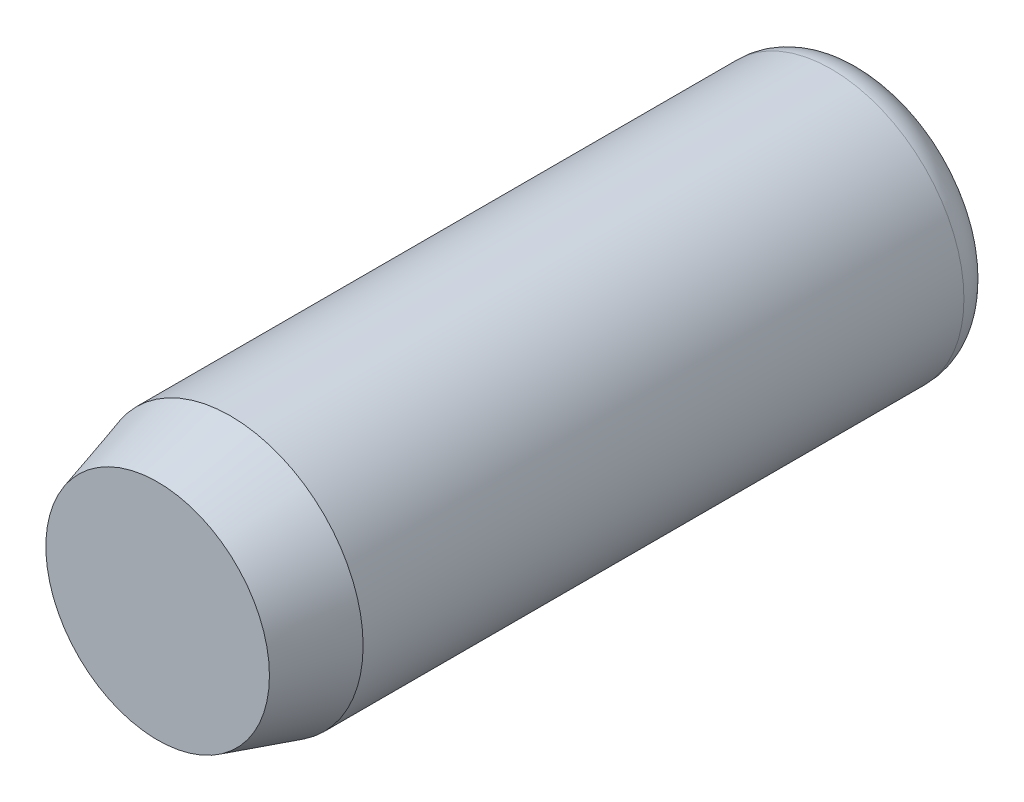
ISO-10303-21;
HEADER;
FILE_DESCRIPTION(('STEP AP214'),'2;1');
FILE_NAME('part.step','',(''),(''),'','','');
FILE_SCHEMA(('AUTOMOTIVE_DESIGN { 1 0 10303 214 1 1 1 1 }'));
ENDSEC;
DATA;
#1=APPLICATION_CONTEXT('core data for automotive mechanical design processes');
#2=APPLICATION_PROTOCOL_DEFINITION('international standard','automotive_design',2000,#1);
#3=PRODUCT_CONTEXT('',#1,'mechanical');
#4=PRODUCT('Part','Part','',(#3));
#5=PRODUCT_RELATED_PRODUCT_CATEGORY('part','',(#4));
#6=PRODUCT_DEFINITION_FORMATION('','',#4);
#7=PRODUCT_DEFINITION_CONTEXT('part definition',#1,'design');
#8=PRODUCT_DEFINITION('design','',#6,#7);
#9=PRODUCT_DEFINITION_SHAPE('','',#8);
#10=(LENGTH_UNIT() NAMED_UNIT(*) SI_UNIT(.MILLI.,.METRE.));
#11=(NAMED_UNIT(*) PLANE_ANGLE_UNIT() SI_UNIT($,.RADIAN.));
#12=(NAMED_UNIT(*) SI_UNIT($,.STERADIAN.) SOLID_ANGLE_UNIT());
#13=UNCERTAINTY_MEASURE_WITH_UNIT(LENGTH_MEASURE(1.E-05),#10,'distance_accuracy_value','');
#14=(GEOMETRIC_REPRESENTATION_CONTEXT(3) GLOBAL_UNCERTAINTY_ASSIGNED_CONTEXT((#13)) GLOBAL_UNIT_ASSIGNED_CONTEXT((#10,
#11,#12)) REPRESENTATION_CONTEXT('',''));
#15=CARTESIAN_POINT('',(0.,0.,0.));
#16=DIRECTION('',(0.,0.,1.));
#17=DIRECTION('',(1.,0.,0.));
#18=AXIS2_PLACEMENT_3D('',#15,#16,#17);
#19=CARTESIAN_POINT('',(0.,0.885825,-3.175));
#20=DIRECTION('',(0.,0.,1.));
#21=DIRECTION('',(1.,0.,0.));
#22=AXIS2_PLACEMENT_3D('',#19,#20,#21);
#23=PLANE('',#22);
#24=CARTESIAN_POINT('',(0.,0.,-3.175));
#25=DIRECTION('',(0.,0.,1.));
#26=DIRECTION('',(1.,0.,0.));
#27=AXIS2_PLACEMENT_3D('',#24,#25,#26);
#28=CIRCLE('',#27,0.885825);
#29=CARTESIAN_POINT('',(0.885825,0.,-3.175));
#30=VERTEX_POINT('',#29);
#31=EDGE_CURVE('E10',#30,#30,#28,.T.);
#32=ORIENTED_EDGE('',*,*,#31,.F.);
#33=EDGE_LOOP('',(#32));
#34=FACE_BOUND('',#33,.T.);
#35=ADVANCED_FACE('F37',(#34),#23,.F.);
#36=CARTESIAN_POINT('',(0.,0.,-2.8702));
#37=DIRECTION('',(0.,0.,1.));
#38=DIRECTION('',(1.,0.,0.));
#39=AXIS2_PLACEMENT_3D('',#36,#37,#38);
#40=TOROIDAL_SURFACE('',#39,0.885825,0.304800000000001);
#41=CARTESIAN_POINT('',(0.,0.,-2.8702));
#42=DIRECTION('',(0.,0.,1.));
#43=DIRECTION('',(1.,0.,0.));
#44=AXIS2_PLACEMENT_3D('',#41,#42,#43);
#45=CIRCLE('',#44,1.190625);
#46=CARTESIAN_POINT('',(1.190625,0.,-2.8702));
#47=VERTEX_POINT('',#46);
#48=EDGE_CURVE('E43',#47,#47,#45,.T.);
#49=ORIENTED_EDGE('',*,*,#48,.F.);
#50=EDGE_LOOP('',(#49));
#51=FACE_BOUND('',#50,.T.);
#52=ORIENTED_EDGE('',*,*,#31,.T.);
#53=EDGE_LOOP('',(#52));
#54=FACE_BOUND('',#53,.T.);
#55=ADVANCED_FACE('F67',(#51,#54),#40,.T.);
#56=CARTESIAN_POINT('',(0.,0.,3.175));
#57=DIRECTION('',(0.,0.,1.));
#58=DIRECTION('',(1.,0.,0.));
#59=AXIS2_PLACEMENT_3D('',#56,#57,#58);
#60=CYLINDRICAL_SURFACE('',#59,1.190625);
#61=CARTESIAN_POINT('',(0.,0.,2.5217200893075));
#62=DIRECTION('',(0.,0.,1.));
#63=DIRECTION('',(1.,0.,0.));
#64=AXIS2_PLACEMENT_3D('',#61,#62,#63);
#65=CIRCLE('',#64,1.190625);
#66=CARTESIAN_POINT('',(1.190625,0.,2.5217200893075));
#67=VERTEX_POINT('',#66);
#68=EDGE_CURVE('E47',#67,#67,#65,.T.);
#69=ORIENTED_EDGE('',*,*,#68,.F.);
#70=EDGE_LOOP('',(#69));
#71=FACE_BOUND('',#70,.T.);
#72=ORIENTED_EDGE('',*,*,#48,.T.);
#73=EDGE_LOOP('',(#72));
#74=FACE_BOUND('',#73,.T.);
#75=ADVANCED_FACE('F62',(#71,#74),#60,.T.);
#76=CARTESIAN_POINT('',(0.,0.,2.5217200893075));
#77=DIRECTION('',(0.,0.,-1.));
#78=DIRECTION('',(-1.,0.,0.));
#79=AXIS2_PLACEMENT_3D('',#76,#77,#78);
#80=CONICAL_SURFACE('',#79,1.190625,0.279252680319095);
#81=CARTESIAN_POINT('',(0.,0.,3.175));
#82=DIRECTION('',(0.,0.,1.));
#83=DIRECTION('',(1.,0.,0.));
#84=AXIS2_PLACEMENT_3D('',#81,#82,#83);
#85=CIRCLE('',#84,1.0033);
#86=CARTESIAN_POINT('',(1.0033,0.,3.175));
#87=VERTEX_POINT('',#86);
#88=EDGE_CURVE('E51',#87,#87,#85,.T.);
#89=ORIENTED_EDGE('',*,*,#88,.F.);
#90=EDGE_LOOP('',(#89));
#91=FACE_BOUND('',#90,.T.);
#92=ORIENTED_EDGE('',*,*,#68,.T.);
#93=EDGE_LOOP('',(#92));
#94=FACE_BOUND('',#93,.T.);
#95=ADVANCED_FACE('F59',(#91,#94),#80,.T.);
#96=CARTESIAN_POINT('',(0.,0.,3.175));
#97=DIRECTION('',(0.,0.,-1.));
#98=DIRECTION('',(-1.,0.,0.));
#99=AXIS2_PLACEMENT_3D('',#96,#97,#98);
#100=PLANE('',#99);
#101=ORIENTED_EDGE('',*,*,#88,.T.);
#102=EDGE_LOOP('',(#101));
#103=FACE_BOUND('',#102,.T.);
#104=ADVANCED_FACE('F57',(#103),#100,.F.);
#105=CLOSED_SHELL('',(#35,#55,#75,#95,#104));
#106=MANIFOLD_SOLID_BREP('B2',#105);
#107=ADVANCED_BREP_SHAPE_REPRESENTATION('',(#18,#106),#14);
#108=SHAPE_DEFINITION_REPRESENTATION(#9,#107);
ENDSEC;
END-ISO-10303-21;
